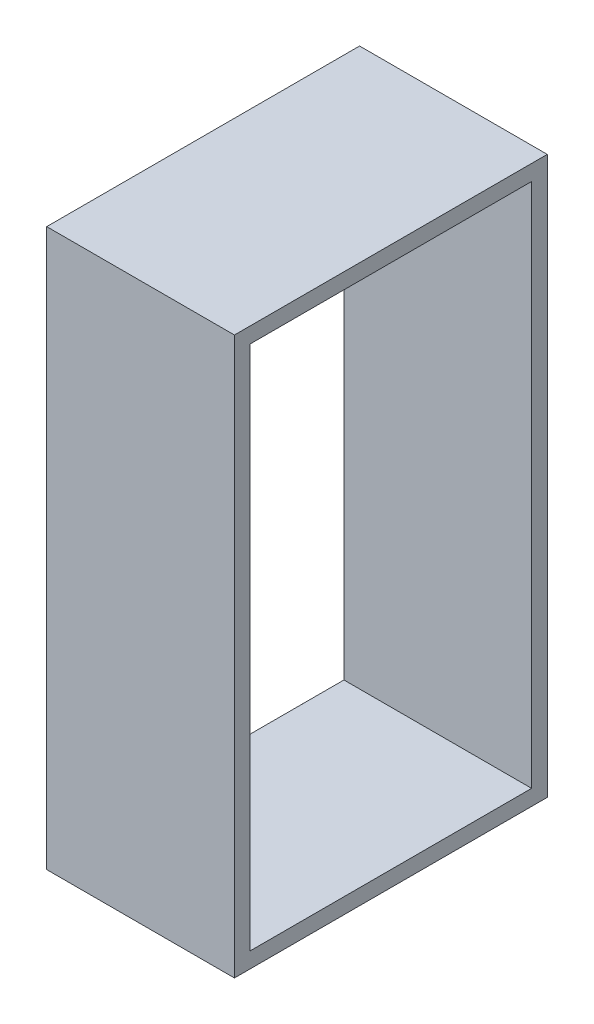
ISO-10303-21;
HEADER;
FILE_DESCRIPTION(('STEP AP214'),'2;1');
FILE_NAME('part.step','',(''),(''),'','','');
FILE_SCHEMA(('AUTOMOTIVE_DESIGN { 1 0 10303 214 1 1 1 1 }'));
ENDSEC;
DATA;
#1=APPLICATION_CONTEXT('core data for automotive mechanical design processes');
#2=APPLICATION_PROTOCOL_DEFINITION('international standard','automotive_design',2000,#1);
#3=PRODUCT_CONTEXT('',#1,'mechanical');
#4=PRODUCT('Part','Part','',(#3));
#5=PRODUCT_RELATED_PRODUCT_CATEGORY('part','',(#4));
#6=PRODUCT_DEFINITION_FORMATION('','',#4);
#7=PRODUCT_DEFINITION_CONTEXT('part definition',#1,'design');
#8=PRODUCT_DEFINITION('design','',#6,#7);
#9=PRODUCT_DEFINITION_SHAPE('','',#8);
#10=(LENGTH_UNIT() NAMED_UNIT(*) SI_UNIT(.MILLI.,.METRE.));
#11=(NAMED_UNIT(*) PLANE_ANGLE_UNIT() SI_UNIT($,.RADIAN.));
#12=(NAMED_UNIT(*) SI_UNIT($,.STERADIAN.) SOLID_ANGLE_UNIT());
#13=UNCERTAINTY_MEASURE_WITH_UNIT(LENGTH_MEASURE(1.E-05),#10,'distance_accuracy_value','');
#14=(GEOMETRIC_REPRESENTATION_CONTEXT(3) GLOBAL_UNCERTAINTY_ASSIGNED_CONTEXT((#13)) GLOBAL_UNIT_ASSIGNED_CONTEXT((#10,
#11,#12)) REPRESENTATION_CONTEXT('',''));
#15=CARTESIAN_POINT('',(0.,0.,0.));
#16=DIRECTION('',(0.,0.,1.));
#17=DIRECTION('',(1.,0.,0.));
#18=AXIS2_PLACEMENT_3D('',#15,#16,#17);
#19=CARTESIAN_POINT('',(-6.,17.8,21.));
#20=DIRECTION('',(1.,0.,0.));
#21=DIRECTION('',(0.,1.,0.));
#22=AXIS2_PLACEMENT_3D('',#19,#20,#21);
#23=PLANE('',#22);
#24=DIRECTION('',(0.,0.,1.));
#25=VECTOR('',#24,1.);
#26=CARTESIAN_POINT('',(-6.,-16.8,21.));
#27=LINE('',#26,#25);
#28=CARTESIAN_POINT('',(-6.,-16.8,22.));
#29=VERTEX_POINT('',#28);
#30=CARTESIAN_POINT('',(-6.,-16.8,40.));
#31=VERTEX_POINT('',#30);
#32=EDGE_CURVE('E68',#29,#31,#27,.T.);
#33=ORIENTED_EDGE('',*,*,#32,.F.);
#34=DIRECTION('',(0.,-1.,0.));
#35=VECTOR('',#34,1.);
#36=CARTESIAN_POINT('',(-6.,17.8,22.));
#37=LINE('',#36,#35);
#38=CARTESIAN_POINT('',(-6.,16.8,22.));
#39=VERTEX_POINT('',#38);
#40=EDGE_CURVE('E94',#39,#29,#37,.T.);
#41=ORIENTED_EDGE('',*,*,#40,.F.);
#42=DIRECTION('',(0.,0.,1.));
#43=VECTOR('',#42,1.);
#44=CARTESIAN_POINT('',(-6.,16.8,21.));
#45=LINE('',#44,#43);
#46=CARTESIAN_POINT('',(-6.,16.8,40.));
#47=VERTEX_POINT('',#46);
#48=EDGE_CURVE('E18',#39,#47,#45,.T.);
#49=ORIENTED_EDGE('',*,*,#48,.T.);
#50=DIRECTION('',(0.,-1.,0.));
#51=VECTOR('',#50,1.);
#52=CARTESIAN_POINT('',(-6.,17.8,40.));
#53=LINE('',#52,#51);
#54=EDGE_CURVE('E65',#47,#31,#53,.T.);
#55=ORIENTED_EDGE('',*,*,#54,.T.);
#56=EDGE_LOOP('',(#33,#41,#49,#55));
#57=FACE_BOUND('',#56,.T.);
#58=DIRECTION('',(0.,1.,0.));
#59=VECTOR('',#58,1.);
#60=CARTESIAN_POINT('',(-6.,-17.8,41.));
#61=LINE('',#60,#59);
#62=CARTESIAN_POINT('',(-6.,-17.8,41.));
#63=VERTEX_POINT('',#62);
#64=CARTESIAN_POINT('',(-6.,17.8,41.));
#65=VERTEX_POINT('',#64);
#66=EDGE_CURVE('E9',#63,#65,#61,.T.);
#67=ORIENTED_EDGE('',*,*,#66,.T.);
#68=DIRECTION('',(0.,0.,-1.));
#69=VECTOR('',#68,1.);
#70=CARTESIAN_POINT('',(-6.,17.8,41.));
#71=LINE('',#70,#69);
#72=CARTESIAN_POINT('',(-6.,17.8,21.));
#73=VERTEX_POINT('',#72);
#74=EDGE_CURVE('E249',#65,#73,#71,.T.);
#75=ORIENTED_EDGE('',*,*,#74,.T.);
#76=DIRECTION('',(0.,-1.,0.));
#77=VECTOR('',#76,1.);
#78=CARTESIAN_POINT('',(-6.,17.8,21.));
#79=LINE('',#78,#77);
#80=CARTESIAN_POINT('',(-6.,-17.8,21.));
#81=VERTEX_POINT('',#80);
#82=EDGE_CURVE('E257',#73,#81,#79,.T.);
#83=ORIENTED_EDGE('',*,*,#82,.T.);
#84=DIRECTION('',(0.,0.,-1.));
#85=VECTOR('',#84,1.);
#86=CARTESIAN_POINT('',(-6.,-17.8,41.));
#87=LINE('',#86,#85);
#88=EDGE_CURVE('E258',#63,#81,#87,.T.);
#89=ORIENTED_EDGE('',*,*,#88,.F.);
#90=EDGE_LOOP('',(#67,#75,#83,#89));
#91=FACE_BOUND('',#90,.T.);
#92=ADVANCED_FACE('F15',(#57,#91),#23,.F.);
#93=CARTESIAN_POINT('',(0.,-17.3,41.));
#94=DIRECTION('',(0.,0.,1.));
#95=DIRECTION('',(1.,0.,0.));
#96=AXIS2_PLACEMENT_3D('',#93,#94,#95);
#97=PLANE('',#96);
#98=DIRECTION('',(1.,0.,0.));
#99=VECTOR('',#98,1.);
#100=CARTESIAN_POINT('',(-6.,-17.8,41.));
#101=LINE('',#100,#99);
#102=CARTESIAN_POINT('',(6.,-17.8,41.));
#103=VERTEX_POINT('',#102);
#104=EDGE_CURVE('E261',#63,#103,#101,.T.);
#105=ORIENTED_EDGE('',*,*,#104,.T.);
#106=DIRECTION('',(0.,-1.,0.));
#107=VECTOR('',#106,1.);
#108=CARTESIAN_POINT('',(6.,17.8,41.));
#109=LINE('',#108,#107);
#110=CARTESIAN_POINT('',(6.,17.8,41.));
#111=VERTEX_POINT('',#110);
#112=EDGE_CURVE('E239',#111,#103,#109,.T.);
#113=ORIENTED_EDGE('',*,*,#112,.F.);
#114=DIRECTION('',(-1.,0.,0.));
#115=VECTOR('',#114,1.);
#116=CARTESIAN_POINT('',(6.,17.8,41.));
#117=LINE('',#116,#115);
#118=EDGE_CURVE('E250',#111,#65,#117,.T.);
#119=ORIENTED_EDGE('',*,*,#118,.T.);
#120=ORIENTED_EDGE('',*,*,#66,.F.);
#121=EDGE_LOOP('',(#105,#113,#119,#120));
#122=FACE_BOUND('',#121,.T.);
#123=ADVANCED_FACE('F137',(#122),#97,.T.);
#124=CARTESIAN_POINT('',(-6.,16.8,21.));
#125=DIRECTION('',(0.,1.,0.));
#126=DIRECTION('',(1.,0.,0.));
#127=AXIS2_PLACEMENT_3D('',#124,#125,#126);
#128=PLANE('',#127);
#129=DIRECTION('',(1.,0.,0.));
#130=VECTOR('',#129,1.);
#131=CARTESIAN_POINT('',(-3.,16.8,40.));
#132=LINE('',#131,#130);
#133=CARTESIAN_POINT('',(6.,16.8,40.));
#134=VERTEX_POINT('',#133);
#135=EDGE_CURVE('E59',#47,#134,#132,.T.);
#136=ORIENTED_EDGE('',*,*,#135,.F.);
#137=ORIENTED_EDGE('',*,*,#48,.F.);
#138=DIRECTION('',(-1.,0.,0.));
#139=VECTOR('',#138,1.);
#140=CARTESIAN_POINT('',(-3.,16.8,22.));
#141=LINE('',#140,#139);
#142=CARTESIAN_POINT('',(6.,16.8,22.));
#143=VERTEX_POINT('',#142);
#144=EDGE_CURVE('E74',#143,#39,#141,.T.);
#145=ORIENTED_EDGE('',*,*,#144,.F.);
#146=DIRECTION('',(0.,0.,1.));
#147=VECTOR('',#146,1.);
#148=CARTESIAN_POINT('',(6.,16.8,21.));
#149=LINE('',#148,#147);
#150=EDGE_CURVE('E71',#143,#134,#149,.T.);
#151=ORIENTED_EDGE('',*,*,#150,.T.);
#152=EDGE_LOOP('',(#136,#137,#145,#151));
#153=FACE_BOUND('',#152,.T.);
#154=ADVANCED_FACE('F73',(#153),#128,.F.);
#155=CARTESIAN_POINT('',(0.,0.,40.));
#156=DIRECTION('',(0.,0.,1.));
#157=DIRECTION('',(1.,0.,0.));
#158=AXIS2_PLACEMENT_3D('',#155,#156,#157);
#159=PLANE('',#158);
#160=ORIENTED_EDGE('',*,*,#135,.T.);
#161=DIRECTION('',(0.,1.,0.));
#162=VECTOR('',#161,1.);
#163=CARTESIAN_POINT('',(6.,-17.8,40.));
#164=LINE('',#163,#162);
#165=CARTESIAN_POINT('',(6.,-16.8,40.));
#166=VERTEX_POINT('',#165);
#167=EDGE_CURVE('E64',#166,#134,#164,.T.);
#168=ORIENTED_EDGE('',*,*,#167,.F.);
#169=DIRECTION('',(-1.,0.,0.));
#170=VECTOR('',#169,1.);
#171=CARTESIAN_POINT('',(3.,-16.8,40.));
#172=LINE('',#171,#170);
#173=EDGE_CURVE('E99',#166,#31,#172,.T.);
#174=ORIENTED_EDGE('',*,*,#173,.T.);
#175=ORIENTED_EDGE('',*,*,#54,.F.);
#176=EDGE_LOOP('',(#160,#168,#174,#175));
#177=FACE_BOUND('',#176,.T.);
#178=ADVANCED_FACE('F58',(#177),#159,.F.);
#179=CARTESIAN_POINT('',(6.,-16.8,21.));
#180=DIRECTION('',(0.,-1.,0.));
#181=DIRECTION('',(0.,0.,-1.));
#182=AXIS2_PLACEMENT_3D('',#179,#180,#181);
#183=PLANE('',#182);
#184=ORIENTED_EDGE('',*,*,#173,.F.);
#185=DIRECTION('',(0.,0.,1.));
#186=VECTOR('',#185,1.);
#187=CARTESIAN_POINT('',(6.,-16.8,21.));
#188=LINE('',#187,#186);
#189=CARTESIAN_POINT('',(6.,-16.8,22.));
#190=VERTEX_POINT('',#189);
#191=EDGE_CURVE('E82',#190,#166,#188,.T.);
#192=ORIENTED_EDGE('',*,*,#191,.F.);
#193=DIRECTION('',(1.,0.,0.));
#194=VECTOR('',#193,1.);
#195=CARTESIAN_POINT('',(3.,-16.8,22.));
#196=LINE('',#195,#194);
#197=EDGE_CURVE('E100',#29,#190,#196,.T.);
#198=ORIENTED_EDGE('',*,*,#197,.F.);
#199=ORIENTED_EDGE('',*,*,#32,.T.);
#200=EDGE_LOOP('',(#184,#192,#198,#199));
#201=FACE_BOUND('',#200,.T.);
#202=ADVANCED_FACE('F144',(#201),#183,.F.);
#203=CARTESIAN_POINT('',(0.,0.,22.));
#204=DIRECTION('',(0.,0.,1.));
#205=DIRECTION('',(1.,0.,0.));
#206=AXIS2_PLACEMENT_3D('',#203,#204,#205);
#207=PLANE('',#206);
#208=ORIENTED_EDGE('',*,*,#144,.T.);
#209=ORIENTED_EDGE('',*,*,#40,.T.);
#210=ORIENTED_EDGE('',*,*,#197,.T.);
#211=DIRECTION('',(0.,1.,0.));
#212=VECTOR('',#211,1.);
#213=CARTESIAN_POINT('',(6.,-17.8,22.));
#214=LINE('',#213,#212);
#215=EDGE_CURVE('E89',#190,#143,#214,.T.);
#216=ORIENTED_EDGE('',*,*,#215,.T.);
#217=EDGE_LOOP('',(#208,#209,#210,#216));
#218=FACE_BOUND('',#217,.T.);
#219=ADVANCED_FACE('F147',(#218),#207,.T.);
#220=CARTESIAN_POINT('',(6.,-17.8,21.));
#221=DIRECTION('',(-1.,0.,0.));
#222=DIRECTION('',(0.,0.,1.));
#223=AXIS2_PLACEMENT_3D('',#220,#221,#222);
#224=PLANE('',#223);
#225=ORIENTED_EDGE('',*,*,#215,.F.);
#226=ORIENTED_EDGE('',*,*,#191,.T.);
#227=ORIENTED_EDGE('',*,*,#167,.T.);
#228=ORIENTED_EDGE('',*,*,#150,.F.);
#229=EDGE_LOOP('',(#225,#226,#227,#228));
#230=FACE_BOUND('',#229,.T.);
#231=DIRECTION('',(0.,0.,1.));
#232=VECTOR('',#231,1.);
#233=CARTESIAN_POINT('',(6.,-17.8,21.));
#234=LINE('',#233,#232);
#235=CARTESIAN_POINT('',(6.,-17.8,21.));
#236=VERTEX_POINT('',#235);
#237=EDGE_CURVE('E267',#236,#103,#234,.T.);
#238=ORIENTED_EDGE('',*,*,#237,.F.);
#239=DIRECTION('',(0.,1.,0.));
#240=VECTOR('',#239,1.);
#241=CARTESIAN_POINT('',(6.,-17.8,21.));
#242=LINE('',#241,#240);
#243=CARTESIAN_POINT('',(6.,17.8,21.));
#244=VERTEX_POINT('',#243);
#245=EDGE_CURVE('E253',#236,#244,#242,.T.);
#246=ORIENTED_EDGE('',*,*,#245,.T.);
#247=DIRECTION('',(0.,0.,1.));
#248=VECTOR('',#247,1.);
#249=CARTESIAN_POINT('',(6.,17.8,21.));
#250=LINE('',#249,#248);
#251=EDGE_CURVE('E244',#244,#111,#250,.T.);
#252=ORIENTED_EDGE('',*,*,#251,.T.);
#253=ORIENTED_EDGE('',*,*,#112,.T.);
#254=EDGE_LOOP('',(#238,#246,#252,#253));
#255=FACE_BOUND('',#254,.T.);
#256=ADVANCED_FACE('F81',(#230,#255),#224,.F.);
#257=CARTESIAN_POINT('',(6.,17.8,21.));
#258=DIRECTION('',(0.,-1.,0.));
#259=DIRECTION('',(0.,0.,-1.));
#260=AXIS2_PLACEMENT_3D('',#257,#258,#259);
#261=PLANE('',#260);
#262=ORIENTED_EDGE('',*,*,#74,.F.);
#263=ORIENTED_EDGE('',*,*,#118,.F.);
#264=ORIENTED_EDGE('',*,*,#251,.F.);
#265=DIRECTION('',(-1.,0.,0.));
#266=VECTOR('',#265,1.);
#267=CARTESIAN_POINT('',(6.,17.8,21.));
#268=LINE('',#267,#266);
#269=EDGE_CURVE('E254',#244,#73,#268,.T.);
#270=ORIENTED_EDGE('',*,*,#269,.T.);
#271=EDGE_LOOP('',(#262,#263,#264,#270));
#272=FACE_BOUND('',#271,.T.);
#273=ADVANCED_FACE('F127',(#272),#261,.F.);
#274=CARTESIAN_POINT('',(0.,0.,21.));
#275=DIRECTION('',(0.,0.,1.));
#276=DIRECTION('',(1.,0.,0.));
#277=AXIS2_PLACEMENT_3D('',#274,#275,#276);
#278=PLANE('',#277);
#279=ORIENTED_EDGE('',*,*,#82,.F.);
#280=ORIENTED_EDGE('',*,*,#269,.F.);
#281=ORIENTED_EDGE('',*,*,#245,.F.);
#282=DIRECTION('',(1.,0.,0.));
#283=VECTOR('',#282,1.);
#284=CARTESIAN_POINT('',(-6.,-17.8,21.));
#285=LINE('',#284,#283);
#286=EDGE_CURVE('E274',#81,#236,#285,.T.);
#287=ORIENTED_EDGE('',*,*,#286,.F.);
#288=EDGE_LOOP('',(#279,#280,#281,#287));
#289=FACE_BOUND('',#288,.T.);
#290=ADVANCED_FACE('F118',(#289),#278,.F.);
#291=CARTESIAN_POINT('',(-6.,-17.8,21.));
#292=DIRECTION('',(0.,1.,0.));
#293=DIRECTION('',(1.,0.,0.));
#294=AXIS2_PLACEMENT_3D('',#291,#292,#293);
#295=PLANE('',#294);
#296=ORIENTED_EDGE('',*,*,#286,.T.);
#297=ORIENTED_EDGE('',*,*,#237,.T.);
#298=ORIENTED_EDGE('',*,*,#104,.F.);
#299=ORIENTED_EDGE('',*,*,#88,.T.);
#300=EDGE_LOOP('',(#296,#297,#298,#299));
#301=FACE_BOUND('',#300,.T.);
#302=ADVANCED_FACE('F111',(#301),#295,.F.);
#303=CLOSED_SHELL('',(#92,#123,#154,#178,#202,#219,#256,#273,#290,#302));
#304=MANIFOLD_SOLID_BREP('B1',#303);
#305=ADVANCED_BREP_SHAPE_REPRESENTATION('',(#18,#304),#14);
#306=SHAPE_DEFINITION_REPRESENTATION(#9,#305);
ENDSEC;
END-ISO-10303-21;
